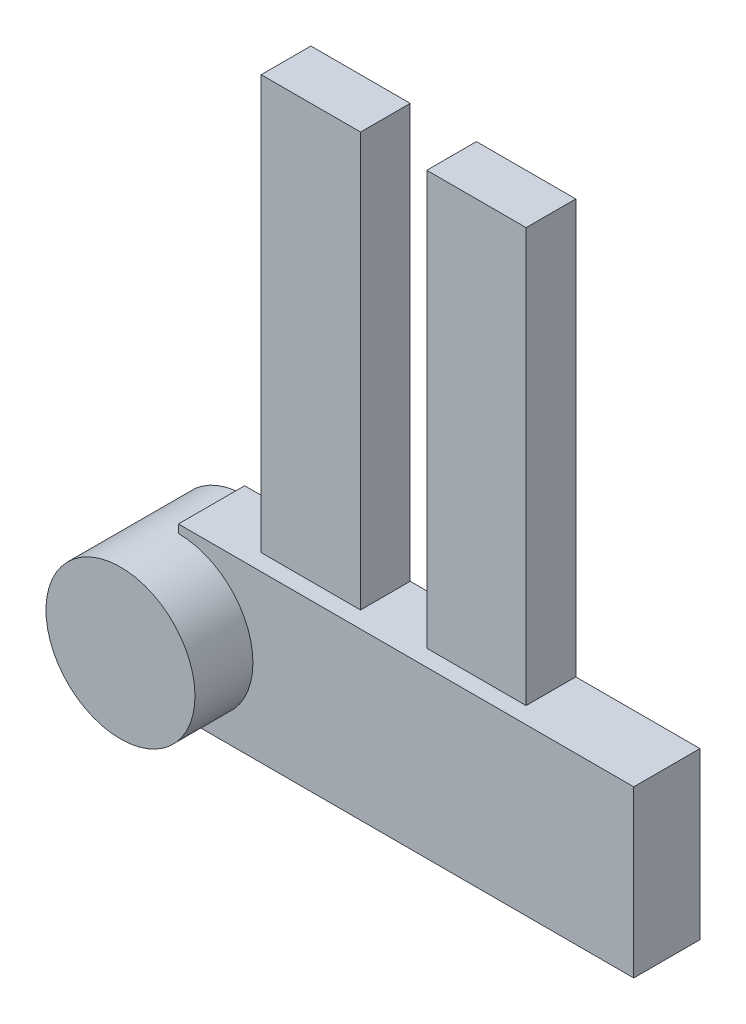
ISO-10303-21;
HEADER;
FILE_DESCRIPTION(('STEP AP214'),'2;1');
FILE_NAME('part.step','',(''),(''),'','','');
FILE_SCHEMA(('AUTOMOTIVE_DESIGN { 1 0 10303 214 1 1 1 1 }'));
ENDSEC;
DATA;
#1=APPLICATION_CONTEXT('core data for automotive mechanical design processes');
#2=APPLICATION_PROTOCOL_DEFINITION('international standard','automotive_design',2000,#1);
#3=PRODUCT_CONTEXT('',#1,'mechanical');
#4=PRODUCT('Part','Part','',(#3));
#5=PRODUCT_RELATED_PRODUCT_CATEGORY('part','',(#4));
#6=PRODUCT_DEFINITION_FORMATION('','',#4);
#7=PRODUCT_DEFINITION_CONTEXT('part definition',#1,'design');
#8=PRODUCT_DEFINITION('design','',#6,#7);
#9=PRODUCT_DEFINITION_SHAPE('','',#8);
#10=(LENGTH_UNIT() NAMED_UNIT(*) SI_UNIT(.MILLI.,.METRE.));
#11=(NAMED_UNIT(*) PLANE_ANGLE_UNIT() SI_UNIT($,.RADIAN.));
#12=(NAMED_UNIT(*) SI_UNIT($,.STERADIAN.) SOLID_ANGLE_UNIT());
#13=UNCERTAINTY_MEASURE_WITH_UNIT(LENGTH_MEASURE(1.E-05),#10,'distance_accuracy_value','');
#14=(GEOMETRIC_REPRESENTATION_CONTEXT(3) GLOBAL_UNCERTAINTY_ASSIGNED_CONTEXT((#13)) GLOBAL_UNIT_ASSIGNED_CONTEXT((#10,
#11,#12)) REPRESENTATION_CONTEXT('',''));
#15=CARTESIAN_POINT('',(0.,0.,0.));
#16=DIRECTION('',(0.,0.,1.));
#17=DIRECTION('',(1.,0.,0.));
#18=AXIS2_PLACEMENT_3D('',#15,#16,#17);
#19=CARTESIAN_POINT('',(230000.,125000.,8000.));
#20=DIRECTION('',(0.,-1.,0.));
#21=DIRECTION('',(0.,0.,-1.));
#22=AXIS2_PLACEMENT_3D('',#19,#20,#21);
#23=PLANE('',#22);
#24=DIRECTION('',(0.,0.,1.));
#25=VECTOR('',#24,1.);
#26=CARTESIAN_POINT('',(258000.,125000.,8000.));
#27=LINE('',#26,#25);
#28=CARTESIAN_POINT('',(258000.,125000.,0.));
#29=VERTEX_POINT('',#28);
#30=CARTESIAN_POINT('',(258000.,125000.,6000.));
#31=VERTEX_POINT('',#30);
#32=EDGE_CURVE('E62',#29,#31,#27,.T.);
#33=ORIENTED_EDGE('',*,*,#32,.F.);
#34=DIRECTION('',(-1.,0.,0.));
#35=VECTOR('',#34,1.);
#36=CARTESIAN_POINT('',(230000.,125000.,0.));
#37=LINE('',#36,#35);
#38=CARTESIAN_POINT('',(250000.,125000.,0.));
#39=VERTEX_POINT('',#38);
#40=EDGE_CURVE('E263',#29,#39,#37,.T.);
#41=ORIENTED_EDGE('',*,*,#40,.T.);
#42=DIRECTION('',(0.,0.,-1.));
#43=VECTOR('',#42,1.);
#44=CARTESIAN_POINT('',(250000.,125000.,8000.));
#45=LINE('',#44,#43);
#46=CARTESIAN_POINT('',(250000.,125000.,6000.));
#47=VERTEX_POINT('',#46);
#48=EDGE_CURVE('E282',#47,#39,#45,.T.);
#49=ORIENTED_EDGE('',*,*,#48,.F.);
#50=DIRECTION('',(1.,0.,0.));
#51=VECTOR('',#50,1.);
#52=CARTESIAN_POINT('',(230000.,125000.,6000.));
#53=LINE('',#52,#51);
#54=CARTESIAN_POINT('',(238000.,125000.,6000.));
#55=VERTEX_POINT('',#54);
#56=EDGE_CURVE('E276',#55,#47,#53,.T.);
#57=ORIENTED_EDGE('',*,*,#56,.F.);
#58=DIRECTION('',(0.,0.,1.));
#59=VECTOR('',#58,1.);
#60=CARTESIAN_POINT('',(238000.,125000.,8000.));
#61=LINE('',#60,#59);
#62=CARTESIAN_POINT('',(238000.,125000.,0.));
#63=VERTEX_POINT('',#62);
#64=EDGE_CURVE('E53',#63,#55,#61,.T.);
#65=ORIENTED_EDGE('',*,*,#64,.F.);
#66=CARTESIAN_POINT('',(230000.,125000.,0.));
#67=VERTEX_POINT('',#66);
#68=EDGE_CURVE('E259',#63,#67,#37,.T.);
#69=ORIENTED_EDGE('',*,*,#68,.T.);
#70=DIRECTION('',(0.,0.,-1.));
#71=VECTOR('',#70,1.);
#72=CARTESIAN_POINT('',(230000.,125000.,8000.));
#73=LINE('',#72,#71);
#74=CARTESIAN_POINT('',(230000.,125000.,8000.));
#75=VERTEX_POINT('',#74);
#76=EDGE_CURVE('E249',#75,#67,#73,.T.);
#77=ORIENTED_EDGE('',*,*,#76,.F.);
#78=DIRECTION('',(-1.,0.,0.));
#79=VECTOR('',#78,1.);
#80=CARTESIAN_POINT('',(230000.,125000.,8000.));
#81=LINE('',#80,#79);
#82=CARTESIAN_POINT('',(285000.,125000.,8000.));
#83=VERTEX_POINT('',#82);
#84=EDGE_CURVE('E248',#83,#75,#81,.T.);
#85=ORIENTED_EDGE('',*,*,#84,.F.);
#86=DIRECTION('',(0.,0.,-1.));
#87=VECTOR('',#86,1.);
#88=CARTESIAN_POINT('',(285000.,125000.,8000.));
#89=LINE('',#88,#87);
#90=CARTESIAN_POINT('',(285000.,125000.,0.));
#91=VERTEX_POINT('',#90);
#92=EDGE_CURVE('E270',#83,#91,#89,.T.);
#93=ORIENTED_EDGE('',*,*,#92,.T.);
#94=CARTESIAN_POINT('',(270000.,125000.,0.));
#95=VERTEX_POINT('',#94);
#96=EDGE_CURVE('E257',#91,#95,#37,.T.);
#97=ORIENTED_EDGE('',*,*,#96,.T.);
#98=DIRECTION('',(0.,0.,-1.));
#99=VECTOR('',#98,1.);
#100=CARTESIAN_POINT('',(270000.,125000.,8000.));
#101=LINE('',#100,#99);
#102=CARTESIAN_POINT('',(270000.,125000.,6000.));
#103=VERTEX_POINT('',#102);
#104=EDGE_CURVE('E165',#103,#95,#101,.T.);
#105=ORIENTED_EDGE('',*,*,#104,.F.);
#106=DIRECTION('',(1.,0.,0.));
#107=VECTOR('',#106,1.);
#108=CARTESIAN_POINT('',(230000.,125000.,6000.));
#109=LINE('',#108,#107);
#110=EDGE_CURVE('E11',#31,#103,#109,.T.);
#111=ORIENTED_EDGE('',*,*,#110,.F.);
#112=EDGE_LOOP('',(#33,#41,#49,#57,#65,#69,#77,#85,#93,#97,#105,#111));
#113=FACE_BOUND('',#112,.T.);
#114=ADVANCED_FACE('F44',(#113),#23,.F.);
#115=CARTESIAN_POINT('',(230000.,105000.,8000.));
#116=DIRECTION('',(1.,0.,0.));
#117=DIRECTION('',(0.,0.,-1.));
#118=AXIS2_PLACEMENT_3D('',#115,#116,#117);
#119=PLANE('',#118);
#120=DIRECTION('',(0.,0.,-1.));
#121=VECTOR('',#120,1.);
#122=CARTESIAN_POINT('',(230000.,106000.,15000.));
#123=LINE('',#122,#121);
#124=CARTESIAN_POINT('',(230000.,106000.,0.));
#125=VERTEX_POINT('',#124);
#126=CARTESIAN_POINT('',(230000.,106000.,8000.));
#127=VERTEX_POINT('',#126);
#128=EDGE_CURVE('E233',#125,#127,#123,.F.);
#129=ORIENTED_EDGE('',*,*,#128,.F.);
#130=DIRECTION('',(0.,-1.,0.));
#131=VECTOR('',#130,1.);
#132=CARTESIAN_POINT('',(230000.,105000.,0.));
#133=LINE('',#132,#131);
#134=CARTESIAN_POINT('',(230000.,105000.,0.));
#135=VERTEX_POINT('',#134);
#136=EDGE_CURVE('E232',#125,#135,#133,.T.);
#137=ORIENTED_EDGE('',*,*,#136,.T.);
#138=DIRECTION('',(0.,0.,-1.));
#139=VECTOR('',#138,1.);
#140=CARTESIAN_POINT('',(230000.,105000.,8000.));
#141=LINE('',#140,#139);
#142=CARTESIAN_POINT('',(230000.,105000.,8000.));
#143=VERTEX_POINT('',#142);
#144=EDGE_CURVE('E274',#143,#135,#141,.T.);
#145=ORIENTED_EDGE('',*,*,#144,.F.);
#146=DIRECTION('',(0.,-1.,0.));
#147=VECTOR('',#146,1.);
#148=CARTESIAN_POINT('',(230000.,105000.,8000.));
#149=LINE('',#148,#147);
#150=EDGE_CURVE('E238',#127,#143,#149,.T.);
#151=ORIENTED_EDGE('',*,*,#150,.F.);
#152=EDGE_LOOP('',(#129,#137,#145,#151));
#153=FACE_BOUND('',#152,.T.);
#154=ADVANCED_FACE('F50',(#153),#119,.F.);
#155=DIRECTION('',(0.,0.,-1.));
#156=VECTOR('',#155,1.);
#157=CARTESIAN_POINT('',(230000.,124000.,15000.));
#158=LINE('',#157,#156);
#159=CARTESIAN_POINT('',(230000.,124000.,8000.));
#160=VERTEX_POINT('',#159);
#161=CARTESIAN_POINT('',(230000.,124000.,0.));
#162=VERTEX_POINT('',#161);
#163=EDGE_CURVE('E229',#160,#162,#158,.T.);
#164=ORIENTED_EDGE('',*,*,#163,.F.);
#165=EDGE_CURVE('E237',#75,#160,#149,.T.);
#166=ORIENTED_EDGE('',*,*,#165,.F.);
#167=ORIENTED_EDGE('',*,*,#76,.T.);
#168=EDGE_CURVE('E247',#67,#162,#133,.T.);
#169=ORIENTED_EDGE('',*,*,#168,.T.);
#170=EDGE_LOOP('',(#164,#166,#167,#169));
#171=FACE_BOUND('',#170,.T.);
#172=ADVANCED_FACE('F329',(#171),#119,.F.);
#173=CARTESIAN_POINT('',(230000.,105000.,8000.));
#174=DIRECTION('',(0.,1.,0.));
#175=DIRECTION('',(0.,0.,1.));
#176=AXIS2_PLACEMENT_3D('',#173,#174,#175);
#177=PLANE('',#176);
#178=DIRECTION('',(1.,0.,0.));
#179=VECTOR('',#178,1.);
#180=CARTESIAN_POINT('',(230000.,105000.,0.));
#181=LINE('',#180,#179);
#182=CARTESIAN_POINT('',(285000.,105000.,0.));
#183=VERTEX_POINT('',#182);
#184=EDGE_CURVE('E251',#135,#183,#181,.T.);
#185=ORIENTED_EDGE('',*,*,#184,.T.);
#186=DIRECTION('',(0.,0.,-1.));
#187=VECTOR('',#186,1.);
#188=CARTESIAN_POINT('',(285000.,105000.,8000.));
#189=LINE('',#188,#187);
#190=CARTESIAN_POINT('',(285000.,105000.,8000.));
#191=VERTEX_POINT('',#190);
#192=EDGE_CURVE('E271',#191,#183,#189,.T.);
#193=ORIENTED_EDGE('',*,*,#192,.F.);
#194=DIRECTION('',(1.,0.,0.));
#195=VECTOR('',#194,1.);
#196=CARTESIAN_POINT('',(230000.,105000.,8000.));
#197=LINE('',#196,#195);
#198=EDGE_CURVE('E239',#143,#191,#197,.T.);
#199=ORIENTED_EDGE('',*,*,#198,.F.);
#200=ORIENTED_EDGE('',*,*,#144,.T.);
#201=EDGE_LOOP('',(#185,#193,#199,#200));
#202=FACE_BOUND('',#201,.T.);
#203=ADVANCED_FACE('F337',(#202),#177,.F.);
#204=CARTESIAN_POINT('',(285000.,105000.,8000.));
#205=DIRECTION('',(-1.,0.,0.));
#206=DIRECTION('',(0.,0.,1.));
#207=AXIS2_PLACEMENT_3D('',#204,#205,#206);
#208=PLANE('',#207);
#209=DIRECTION('',(0.,1.,0.));
#210=VECTOR('',#209,1.);
#211=CARTESIAN_POINT('',(285000.,105000.,0.));
#212=LINE('',#211,#210);
#213=EDGE_CURVE('E258',#183,#91,#212,.T.);
#214=ORIENTED_EDGE('',*,*,#213,.T.);
#215=ORIENTED_EDGE('',*,*,#92,.F.);
#216=DIRECTION('',(0.,1.,0.));
#217=VECTOR('',#216,1.);
#218=CARTESIAN_POINT('',(285000.,105000.,8000.));
#219=LINE('',#218,#217);
#220=EDGE_CURVE('E242',#191,#83,#219,.T.);
#221=ORIENTED_EDGE('',*,*,#220,.F.);
#222=ORIENTED_EDGE('',*,*,#192,.T.);
#223=EDGE_LOOP('',(#214,#215,#221,#222));
#224=FACE_BOUND('',#223,.T.);
#225=ADVANCED_FACE('F333',(#224),#208,.F.);
#226=CARTESIAN_POINT('',(0.,0.,8000.));
#227=DIRECTION('',(0.,0.,-1.));
#228=DIRECTION('',(-1.,0.,0.));
#229=AXIS2_PLACEMENT_3D('',#226,#227,#228);
#230=PLANE('',#229);
#231=CARTESIAN_POINT('',(230000.,115000.,8000.));
#232=DIRECTION('',(0.,0.,-1.));
#233=DIRECTION('',(-1.,0.,0.));
#234=AXIS2_PLACEMENT_3D('',#231,#232,#233);
#235=CIRCLE('',#234,9000.);
#236=EDGE_CURVE('E219',#127,#160,#235,.F.);
#237=ORIENTED_EDGE('',*,*,#236,.F.);
#238=ORIENTED_EDGE('',*,*,#150,.T.);
#239=ORIENTED_EDGE('',*,*,#198,.T.);
#240=ORIENTED_EDGE('',*,*,#220,.T.);
#241=ORIENTED_EDGE('',*,*,#84,.T.);
#242=ORIENTED_EDGE('',*,*,#165,.T.);
#243=EDGE_LOOP('',(#237,#238,#239,#240,#241,#242));
#244=FACE_BOUND('',#243,.T.);
#245=ADVANCED_FACE('F339',(#244),#230,.F.);
#246=CARTESIAN_POINT('',(0.,0.,0.));
#247=DIRECTION('',(0.,0.,-1.));
#248=DIRECTION('',(-1.,0.,0.));
#249=AXIS2_PLACEMENT_3D('',#246,#247,#248);
#250=PLANE('',#249);
#251=ORIENTED_EDGE('',*,*,#40,.F.);
#252=DIRECTION('',(0.,-1.,0.));
#253=VECTOR('',#252,1.);
#254=CARTESIAN_POINT('',(258000.,123000.,0.));
#255=LINE('',#254,#253);
#256=CARTESIAN_POINT('',(258000.,175000.,0.));
#257=VERTEX_POINT('',#256);
#258=EDGE_CURVE('E175',#257,#29,#255,.T.);
#259=ORIENTED_EDGE('',*,*,#258,.F.);
#260=DIRECTION('',(-1.,0.,0.));
#261=VECTOR('',#260,1.);
#262=CARTESIAN_POINT('',(258000.,175000.,0.));
#263=LINE('',#262,#261);
#264=CARTESIAN_POINT('',(270000.,175000.,0.));
#265=VERTEX_POINT('',#264);
#266=EDGE_CURVE('E177',#265,#257,#263,.T.);
#267=ORIENTED_EDGE('',*,*,#266,.F.);
#268=DIRECTION('',(0.,1.,0.));
#269=VECTOR('',#268,1.);
#270=CARTESIAN_POINT('',(270000.,123000.,0.));
#271=LINE('',#270,#269);
#272=EDGE_CURVE('E158',#95,#265,#271,.T.);
#273=ORIENTED_EDGE('',*,*,#272,.F.);
#274=ORIENTED_EDGE('',*,*,#96,.F.);
#275=ORIENTED_EDGE('',*,*,#213,.F.);
#276=ORIENTED_EDGE('',*,*,#184,.F.);
#277=ORIENTED_EDGE('',*,*,#136,.F.);
#278=CARTESIAN_POINT('',(230000.,115000.,0.));
#279=DIRECTION('',(0.,0.,1.));
#280=DIRECTION('',(1.,0.,0.));
#281=AXIS2_PLACEMENT_3D('',#278,#279,#280);
#282=CIRCLE('',#281,9000.);
#283=EDGE_CURVE('E214',#162,#125,#282,.T.);
#284=ORIENTED_EDGE('',*,*,#283,.F.);
#285=ORIENTED_EDGE('',*,*,#168,.F.);
#286=ORIENTED_EDGE('',*,*,#68,.F.);
#287=DIRECTION('',(0.,-1.,0.));
#288=VECTOR('',#287,1.);
#289=CARTESIAN_POINT('',(238000.,123000.,0.));
#290=LINE('',#289,#288);
#291=CARTESIAN_POINT('',(238000.,175000.,0.));
#292=VERTEX_POINT('',#291);
#293=EDGE_CURVE('E189',#292,#63,#290,.T.);
#294=ORIENTED_EDGE('',*,*,#293,.F.);
#295=DIRECTION('',(-1.,0.,0.));
#296=VECTOR('',#295,1.);
#297=CARTESIAN_POINT('',(238000.,175000.,0.));
#298=LINE('',#297,#296);
#299=CARTESIAN_POINT('',(250000.,175000.,0.));
#300=VERTEX_POINT('',#299);
#301=EDGE_CURVE('E191',#300,#292,#298,.T.);
#302=ORIENTED_EDGE('',*,*,#301,.F.);
#303=DIRECTION('',(0.,1.,0.));
#304=VECTOR('',#303,1.);
#305=CARTESIAN_POINT('',(250000.,123000.,0.));
#306=LINE('',#305,#304);
#307=EDGE_CURVE('E201',#39,#300,#306,.T.);
#308=ORIENTED_EDGE('',*,*,#307,.F.);
#309=EDGE_LOOP('',(#251,#259,#267,#273,#274,#275,#276,#277,#284,#285,#286,#294,#302,#308));
#310=FACE_BOUND('',#309,.T.);
#311=ADVANCED_FACE('F301',(#310),#250,.T.);
#312=CARTESIAN_POINT('',(230000.,115000.,15000.));
#313=DIRECTION('',(0.,0.,-1.));
#314=DIRECTION('',(-1.,0.,0.));
#315=AXIS2_PLACEMENT_3D('',#312,#313,#314);
#316=CYLINDRICAL_SURFACE('',#315,9000.);
#317=CARTESIAN_POINT('',(230000.,115000.,15000.));
#318=DIRECTION('',(0.,0.,1.));
#319=DIRECTION('',(1.,0.,0.));
#320=AXIS2_PLACEMENT_3D('',#317,#318,#319);
#321=CIRCLE('',#320,9000.);
#322=CARTESIAN_POINT('',(239000.,115000.,15000.));
#323=VERTEX_POINT('',#322);
#324=EDGE_CURVE('E216',#323,#323,#321,.T.);
#325=ORIENTED_EDGE('',*,*,#324,.F.);
#326=EDGE_LOOP('',(#325));
#327=FACE_BOUND('',#326,.T.);
#328=ORIENTED_EDGE('',*,*,#283,.T.);
#329=ORIENTED_EDGE('',*,*,#128,.T.);
#330=ORIENTED_EDGE('',*,*,#236,.T.);
#331=ORIENTED_EDGE('',*,*,#163,.T.);
#332=EDGE_LOOP('',(#328,#329,#330,#331));
#333=FACE_BOUND('',#332,.T.);
#334=ADVANCED_FACE('F362',(#327,#333),#316,.T.);
#335=CARTESIAN_POINT('',(230000.,115000.,15000.));
#336=DIRECTION('',(0.,0.,1.));
#337=DIRECTION('',(1.,0.,0.));
#338=AXIS2_PLACEMENT_3D('',#335,#336,#337);
#339=PLANE('',#338);
#340=ORIENTED_EDGE('',*,*,#324,.T.);
#341=EDGE_LOOP('',(#340));
#342=FACE_BOUND('',#341,.T.);
#343=ADVANCED_FACE('F319',(#342),#339,.T.);
#344=CARTESIAN_POINT('',(238000.,123000.,6000.));
#345=DIRECTION('',(1.,0.,0.));
#346=DIRECTION('',(0.,0.,-1.));
#347=AXIS2_PLACEMENT_3D('',#344,#345,#346);
#348=PLANE('',#347);
#349=ORIENTED_EDGE('',*,*,#293,.T.);
#350=ORIENTED_EDGE('',*,*,#64,.T.);
#351=DIRECTION('',(0.,-1.,0.));
#352=VECTOR('',#351,1.);
#353=CARTESIAN_POINT('',(238000.,123000.,6000.));
#354=LINE('',#353,#352);
#355=CARTESIAN_POINT('',(238000.,175000.,6000.));
#356=VERTEX_POINT('',#355);
#357=EDGE_CURVE('E187',#356,#55,#354,.T.);
#358=ORIENTED_EDGE('',*,*,#357,.F.);
#359=DIRECTION('',(0.,0.,-1.));
#360=VECTOR('',#359,1.);
#361=CARTESIAN_POINT('',(238000.,175000.,6000.));
#362=LINE('',#361,#360);
#363=EDGE_CURVE('E200',#356,#292,#362,.T.);
#364=ORIENTED_EDGE('',*,*,#363,.T.);
#365=EDGE_LOOP('',(#349,#350,#358,#364));
#366=FACE_BOUND('',#365,.T.);
#367=ADVANCED_FACE('F287',(#366),#348,.F.);
#368=CARTESIAN_POINT('',(250000.,123000.,6000.));
#369=DIRECTION('',(-1.,0.,0.));
#370=DIRECTION('',(0.,0.,1.));
#371=AXIS2_PLACEMENT_3D('',#368,#369,#370);
#372=PLANE('',#371);
#373=DIRECTION('',(0.,1.,0.));
#374=VECTOR('',#373,1.);
#375=CARTESIAN_POINT('',(250000.,123000.,6000.));
#376=LINE('',#375,#374);
#377=CARTESIAN_POINT('',(250000.,175000.,6000.));
#378=VERTEX_POINT('',#377);
#379=EDGE_CURVE('E195',#47,#378,#376,.T.);
#380=ORIENTED_EDGE('',*,*,#379,.F.);
#381=ORIENTED_EDGE('',*,*,#48,.T.);
#382=ORIENTED_EDGE('',*,*,#307,.T.);
#383=DIRECTION('',(0.,0.,-1.));
#384=VECTOR('',#383,1.);
#385=CARTESIAN_POINT('',(250000.,175000.,6000.));
#386=LINE('',#385,#384);
#387=EDGE_CURVE('E211',#378,#300,#386,.T.);
#388=ORIENTED_EDGE('',*,*,#387,.F.);
#389=EDGE_LOOP('',(#380,#381,#382,#388));
#390=FACE_BOUND('',#389,.T.);
#391=ADVANCED_FACE('F315',(#390),#372,.F.);
#392=CARTESIAN_POINT('',(0.,0.,6000.));
#393=DIRECTION('',(0.,0.,-1.));
#394=DIRECTION('',(-1.,0.,0.));
#395=AXIS2_PLACEMENT_3D('',#392,#393,#394);
#396=PLANE('',#395);
#397=ORIENTED_EDGE('',*,*,#357,.T.);
#398=ORIENTED_EDGE('',*,*,#56,.T.);
#399=ORIENTED_EDGE('',*,*,#379,.T.);
#400=DIRECTION('',(-1.,0.,0.));
#401=VECTOR('',#400,1.);
#402=CARTESIAN_POINT('',(238000.,175000.,6000.));
#403=LINE('',#402,#401);
#404=EDGE_CURVE('E198',#378,#356,#403,.T.);
#405=ORIENTED_EDGE('',*,*,#404,.T.);
#406=EDGE_LOOP('',(#397,#398,#399,#405));
#407=FACE_BOUND('',#406,.T.);
#408=ADVANCED_FACE('F294',(#407),#396,.F.);
#409=CARTESIAN_POINT('',(238000.,175000.,6000.));
#410=DIRECTION('',(0.,-1.,0.));
#411=DIRECTION('',(0.,0.,-1.));
#412=AXIS2_PLACEMENT_3D('',#409,#410,#411);
#413=PLANE('',#412);
#414=ORIENTED_EDGE('',*,*,#301,.T.);
#415=ORIENTED_EDGE('',*,*,#363,.F.);
#416=ORIENTED_EDGE('',*,*,#404,.F.);
#417=ORIENTED_EDGE('',*,*,#387,.T.);
#418=EDGE_LOOP('',(#414,#415,#416,#417));
#419=FACE_BOUND('',#418,.T.);
#420=ADVANCED_FACE('F296',(#419),#413,.F.);
#421=CARTESIAN_POINT('',(0.,0.,6000.));
#422=DIRECTION('',(0.,0.,-1.));
#423=DIRECTION('',(-1.,0.,0.));
#424=AXIS2_PLACEMENT_3D('',#421,#422,#423);
#425=PLANE('',#424);
#426=DIRECTION('',(0.,-1.,0.));
#427=VECTOR('',#426,1.);
#428=CARTESIAN_POINT('',(258000.,123000.,6000.));
#429=LINE('',#428,#427);
#430=CARTESIAN_POINT('',(258000.,175000.,6000.));
#431=VERTEX_POINT('',#430);
#432=EDGE_CURVE('E155',#431,#31,#429,.T.);
#433=ORIENTED_EDGE('',*,*,#432,.T.);
#434=ORIENTED_EDGE('',*,*,#110,.T.);
#435=DIRECTION('',(0.,1.,0.));
#436=VECTOR('',#435,1.);
#437=CARTESIAN_POINT('',(270000.,123000.,6000.));
#438=LINE('',#437,#436);
#439=CARTESIAN_POINT('',(270000.,175000.,6000.));
#440=VERTEX_POINT('',#439);
#441=EDGE_CURVE('E142',#103,#440,#438,.T.);
#442=ORIENTED_EDGE('',*,*,#441,.T.);
#443=DIRECTION('',(-1.,0.,0.));
#444=VECTOR('',#443,1.);
#445=CARTESIAN_POINT('',(258000.,175000.,6000.));
#446=LINE('',#445,#444);
#447=EDGE_CURVE('E150',#440,#431,#446,.T.);
#448=ORIENTED_EDGE('',*,*,#447,.T.);
#449=EDGE_LOOP('',(#433,#434,#442,#448));
#450=FACE_BOUND('',#449,.T.);
#451=ADVANCED_FACE('F144',(#450),#425,.F.);
#452=CARTESIAN_POINT('',(258000.,123000.,6000.));
#453=DIRECTION('',(1.,0.,0.));
#454=DIRECTION('',(0.,0.,-1.));
#455=AXIS2_PLACEMENT_3D('',#452,#453,#454);
#456=PLANE('',#455);
#457=ORIENTED_EDGE('',*,*,#258,.T.);
#458=ORIENTED_EDGE('',*,*,#32,.T.);
#459=ORIENTED_EDGE('',*,*,#432,.F.);
#460=DIRECTION('',(0.,0.,-1.));
#461=VECTOR('',#460,1.);
#462=CARTESIAN_POINT('',(258000.,175000.,6000.));
#463=LINE('',#462,#461);
#464=EDGE_CURVE('E162',#431,#257,#463,.T.);
#465=ORIENTED_EDGE('',*,*,#464,.T.);
#466=EDGE_LOOP('',(#457,#458,#459,#465));
#467=FACE_BOUND('',#466,.T.);
#468=ADVANCED_FACE('F456',(#467),#456,.F.);
#469=CARTESIAN_POINT('',(270000.,123000.,6000.));
#470=DIRECTION('',(-1.,0.,0.));
#471=DIRECTION('',(0.,0.,1.));
#472=AXIS2_PLACEMENT_3D('',#469,#470,#471);
#473=PLANE('',#472);
#474=ORIENTED_EDGE('',*,*,#441,.F.);
#475=ORIENTED_EDGE('',*,*,#104,.T.);
#476=ORIENTED_EDGE('',*,*,#272,.T.);
#477=DIRECTION('',(0.,0.,-1.));
#478=VECTOR('',#477,1.);
#479=CARTESIAN_POINT('',(270000.,175000.,6000.));
#480=LINE('',#479,#478);
#481=EDGE_CURVE('E154',#440,#265,#480,.T.);
#482=ORIENTED_EDGE('',*,*,#481,.F.);
#483=EDGE_LOOP('',(#474,#475,#476,#482));
#484=FACE_BOUND('',#483,.T.);
#485=ADVANCED_FACE('F156',(#484),#473,.F.);
#486=CARTESIAN_POINT('',(258000.,175000.,6000.));
#487=DIRECTION('',(0.,-1.,0.));
#488=DIRECTION('',(0.,0.,-1.));
#489=AXIS2_PLACEMENT_3D('',#486,#487,#488);
#490=PLANE('',#489);
#491=ORIENTED_EDGE('',*,*,#266,.T.);
#492=ORIENTED_EDGE('',*,*,#464,.F.);
#493=ORIENTED_EDGE('',*,*,#447,.F.);
#494=ORIENTED_EDGE('',*,*,#481,.T.);
#495=EDGE_LOOP('',(#491,#492,#493,#494));
#496=FACE_BOUND('',#495,.T.);
#497=ADVANCED_FACE('F164',(#496),#490,.F.);
#498=CLOSED_SHELL('',(#114,#154,#172,#203,#225,#245,#311,#334,#343,#367,#391,#408,#420,#451,
#468,#485,#497));
#499=MANIFOLD_SOLID_BREP('B2',#498);
#500=ADVANCED_BREP_SHAPE_REPRESENTATION('',(#18,#499),#14);
#501=SHAPE_DEFINITION_REPRESENTATION(#9,#500);
ENDSEC;
END-ISO-10303-21;
